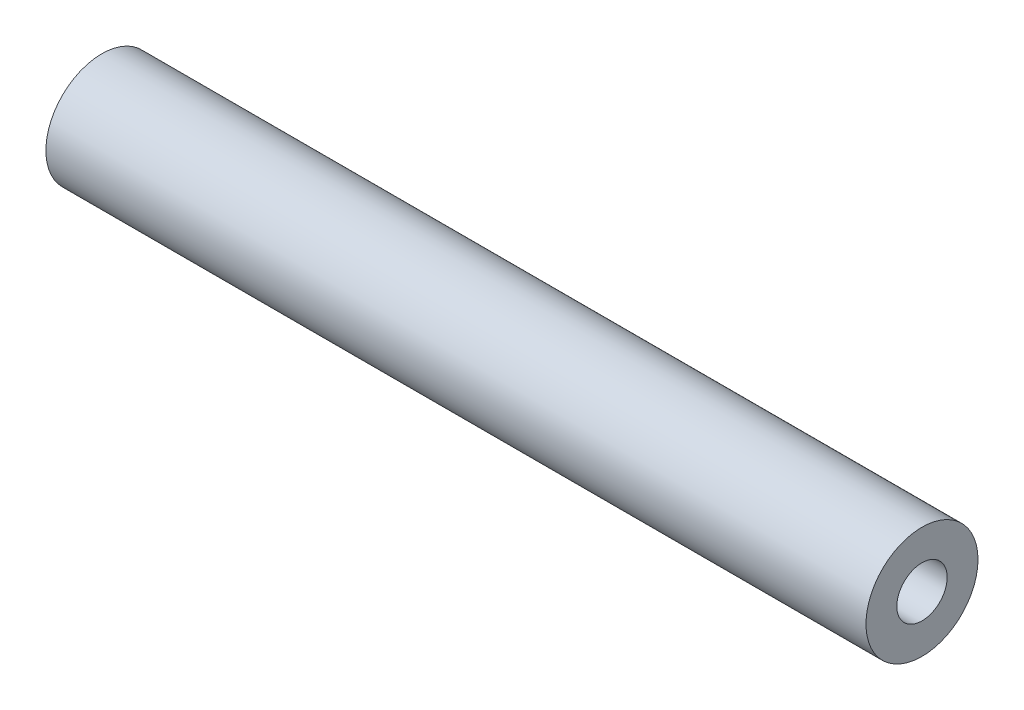
ISO-10303-21;
HEADER;
FILE_DESCRIPTION(('STEP AP214'),'2;1');
FILE_NAME('part.step','',(''),(''),'','','');
FILE_SCHEMA(('AUTOMOTIVE_DESIGN { 1 0 10303 214 1 1 1 1 }'));
ENDSEC;
DATA;
#1=APPLICATION_CONTEXT('core data for automotive mechanical design processes');
#2=APPLICATION_PROTOCOL_DEFINITION('international standard','automotive_design',2000,#1);
#3=PRODUCT_CONTEXT('',#1,'mechanical');
#4=PRODUCT('Part','Part','',(#3));
#5=PRODUCT_RELATED_PRODUCT_CATEGORY('part','',(#4));
#6=PRODUCT_DEFINITION_FORMATION('','',#4);
#7=PRODUCT_DEFINITION_CONTEXT('part definition',#1,'design');
#8=PRODUCT_DEFINITION('design','',#6,#7);
#9=PRODUCT_DEFINITION_SHAPE('','',#8);
#10=(LENGTH_UNIT() NAMED_UNIT(*) SI_UNIT(.MILLI.,.METRE.));
#11=(NAMED_UNIT(*) PLANE_ANGLE_UNIT() SI_UNIT($,.RADIAN.));
#12=(NAMED_UNIT(*) SI_UNIT($,.STERADIAN.) SOLID_ANGLE_UNIT());
#13=UNCERTAINTY_MEASURE_WITH_UNIT(LENGTH_MEASURE(1.E-05),#10,'distance_accuracy_value','');
#14=(GEOMETRIC_REPRESENTATION_CONTEXT(3) GLOBAL_UNCERTAINTY_ASSIGNED_CONTEXT((#13)) GLOBAL_UNIT_ASSIGNED_CONTEXT((#10,
#11,#12)) REPRESENTATION_CONTEXT('',''));
#15=CARTESIAN_POINT('',(0.,0.,0.));
#16=DIRECTION('',(0.,0.,1.));
#17=DIRECTION('',(1.,0.,0.));
#18=AXIS2_PLACEMENT_3D('',#15,#16,#17);
#19=CARTESIAN_POINT('',(65.16,0.,0.));
#20=DIRECTION('',(1.,0.,0.));
#21=DIRECTION('',(0.,0.,-1.));
#22=AXIS2_PLACEMENT_3D('',#19,#20,#21);
#23=PLANE('',#22);
#24=CARTESIAN_POINT('',(65.16,0.,0.));
#25=DIRECTION('',(1.,0.,0.));
#26=DIRECTION('',(0.,0.,-1.));
#27=AXIS2_PLACEMENT_3D('',#24,#25,#26);
#28=CIRCLE('',#27,4.45);
#29=CARTESIAN_POINT('',(65.16,0.,-4.45));
#30=VERTEX_POINT('',#29);
#31=EDGE_CURVE('E10',#30,#30,#28,.T.);
#32=ORIENTED_EDGE('',*,*,#31,.T.);
#33=EDGE_LOOP('',(#32));
#34=FACE_BOUND('',#33,.T.);
#35=CARTESIAN_POINT('',(65.16,0.,0.));
#36=DIRECTION('',(1.,0.,0.));
#37=DIRECTION('',(0.,0.,-1.));
#38=AXIS2_PLACEMENT_3D('',#35,#36,#37);
#39=CIRCLE('',#38,2.);
#40=CARTESIAN_POINT('',(65.16,0.,-2.));
#41=VERTEX_POINT('',#40);
#42=EDGE_CURVE('E46',#41,#41,#39,.T.);
#43=ORIENTED_EDGE('',*,*,#42,.F.);
#44=EDGE_LOOP('',(#43));
#45=FACE_BOUND('',#44,.T.);
#46=ADVANCED_FACE('F35',(#34,#45),#23,.T.);
#47=CARTESIAN_POINT('',(0.,0.,0.));
#48=DIRECTION('',(1.,0.,0.));
#49=DIRECTION('',(0.,0.,-1.));
#50=AXIS2_PLACEMENT_3D('',#47,#48,#49);
#51=PLANE('',#50);
#52=CARTESIAN_POINT('',(0.,0.,0.));
#53=DIRECTION('',(1.,0.,0.));
#54=DIRECTION('',(0.,0.,-1.));
#55=AXIS2_PLACEMENT_3D('',#52,#53,#54);
#56=CIRCLE('',#55,4.45);
#57=CARTESIAN_POINT('',(0.,0.,-4.45));
#58=VERTEX_POINT('',#57);
#59=EDGE_CURVE('E39',#58,#58,#56,.T.);
#60=ORIENTED_EDGE('',*,*,#59,.F.);
#61=EDGE_LOOP('',(#60));
#62=FACE_BOUND('',#61,.T.);
#63=CARTESIAN_POINT('',(0.,0.,0.));
#64=DIRECTION('',(1.,0.,0.));
#65=DIRECTION('',(0.,0.,-1.));
#66=AXIS2_PLACEMENT_3D('',#63,#64,#65);
#67=CIRCLE('',#66,2.);
#68=CARTESIAN_POINT('',(0.,0.,-2.));
#69=VERTEX_POINT('',#68);
#70=EDGE_CURVE('E48',#69,#69,#67,.T.);
#71=ORIENTED_EDGE('',*,*,#70,.T.);
#72=EDGE_LOOP('',(#71));
#73=FACE_BOUND('',#72,.T.);
#74=ADVANCED_FACE('F58',(#62,#73),#51,.F.);
#75=CARTESIAN_POINT('',(65.16,0.,0.));
#76=DIRECTION('',(-1.,0.,0.));
#77=DIRECTION('',(0.,0.,1.));
#78=AXIS2_PLACEMENT_3D('',#75,#76,#77);
#79=CYLINDRICAL_SURFACE('',#78,4.45);
#80=ORIENTED_EDGE('',*,*,#31,.F.);
#81=EDGE_LOOP('',(#80));
#82=FACE_BOUND('',#81,.T.);
#83=ORIENTED_EDGE('',*,*,#59,.T.);
#84=EDGE_LOOP('',(#83));
#85=FACE_BOUND('',#84,.T.);
#86=ADVANCED_FACE('F37',(#82,#85),#79,.T.);
#87=CARTESIAN_POINT('',(65.16,0.,0.));
#88=DIRECTION('',(-1.,0.,0.));
#89=DIRECTION('',(0.,0.,1.));
#90=AXIS2_PLACEMENT_3D('',#87,#88,#89);
#91=CYLINDRICAL_SURFACE('',#90,2.);
#92=ORIENTED_EDGE('',*,*,#42,.T.);
#93=EDGE_LOOP('',(#92));
#94=FACE_BOUND('',#93,.T.);
#95=ORIENTED_EDGE('',*,*,#70,.F.);
#96=EDGE_LOOP('',(#95));
#97=FACE_BOUND('',#96,.T.);
#98=ADVANCED_FACE('F54',(#94,#97),#91,.F.);
#99=CLOSED_SHELL('',(#46,#74,#86,#98));
#100=MANIFOLD_SOLID_BREP('B2',#99);
#101=ADVANCED_BREP_SHAPE_REPRESENTATION('',(#18,#100),#14);
#102=SHAPE_DEFINITION_REPRESENTATION(#9,#101);
ENDSEC;
END-ISO-10303-21;
